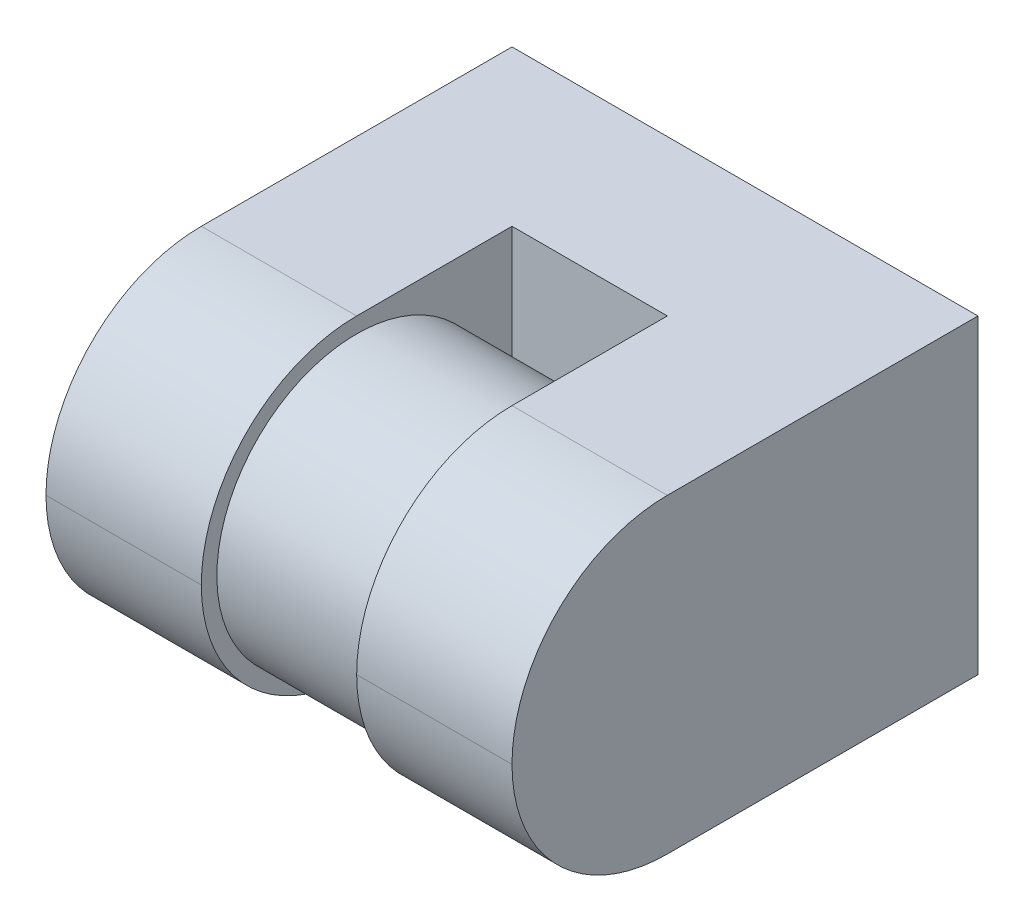
ISO-10303-21;
HEADER;
FILE_DESCRIPTION(('STEP AP214'),'2;1');
FILE_NAME('part.step','',(''),(''),'','','');
FILE_SCHEMA(('AUTOMOTIVE_DESIGN { 1 0 10303 214 1 1 1 1 }'));
ENDSEC;
DATA;
#1=APPLICATION_CONTEXT('core data for automotive mechanical design processes');
#2=APPLICATION_PROTOCOL_DEFINITION('international standard','automotive_design',2000,#1);
#3=PRODUCT_CONTEXT('',#1,'mechanical');
#4=PRODUCT('Part','Part','',(#3));
#5=PRODUCT_RELATED_PRODUCT_CATEGORY('part','',(#4));
#6=PRODUCT_DEFINITION_FORMATION('','',#4);
#7=PRODUCT_DEFINITION_CONTEXT('part definition',#1,'design');
#8=PRODUCT_DEFINITION('design','',#6,#7);
#9=PRODUCT_DEFINITION_SHAPE('','',#8);
#10=(LENGTH_UNIT() NAMED_UNIT(*) SI_UNIT(.MILLI.,.METRE.));
#11=(NAMED_UNIT(*) PLANE_ANGLE_UNIT() SI_UNIT($,.RADIAN.));
#12=(NAMED_UNIT(*) SI_UNIT($,.STERADIAN.) SOLID_ANGLE_UNIT());
#13=UNCERTAINTY_MEASURE_WITH_UNIT(LENGTH_MEASURE(1.E-05),#10,'distance_accuracy_value','');
#14=(GEOMETRIC_REPRESENTATION_CONTEXT(3) GLOBAL_UNCERTAINTY_ASSIGNED_CONTEXT((#13)) GLOBAL_UNIT_ASSIGNED_CONTEXT((#10,
#11,#12)) REPRESENTATION_CONTEXT('',''));
#15=CARTESIAN_POINT('',(0.,0.,0.));
#16=DIRECTION('',(0.,0.,1.));
#17=DIRECTION('',(1.,0.,0.));
#18=AXIS2_PLACEMENT_3D('',#15,#16,#17);
#19=CARTESIAN_POINT('',(0.,0.,10.));
#20=DIRECTION('',(0.,0.,-1.));
#21=DIRECTION('',(-1.,0.,0.));
#22=AXIS2_PLACEMENT_3D('',#19,#20,#21);
#23=PLANE('',#22);
#24=CARTESIAN_POINT('',(15.,10.,10.));
#25=DIRECTION('',(0.,0.,1.));
#26=DIRECTION('',(1.,0.,0.));
#27=AXIS2_PLACEMENT_3D('',#24,#25,#26);
#28=CIRCLE('',#27,2.6);
#29=CARTESIAN_POINT('',(17.6,10.,10.));
#30=VERTEX_POINT('',#29);
#31=EDGE_CURVE('E162',#30,#30,#28,.T.);
#32=ORIENTED_EDGE('',*,*,#31,.F.);
#33=EDGE_LOOP('',(#32));
#34=FACE_BOUND('',#33,.T.);
#35=DIRECTION('',(0.,-1.,0.));
#36=VECTOR('',#35,1.);
#37=CARTESIAN_POINT('',(20.,0.,10.));
#38=LINE('',#37,#36);
#39=CARTESIAN_POINT('',(20.,20.,10.));
#40=VERTEX_POINT('',#39);
#41=CARTESIAN_POINT('',(20.,0.,10.));
#42=VERTEX_POINT('',#41);
#43=EDGE_CURVE('E127',#40,#42,#38,.T.);
#44=ORIENTED_EDGE('',*,*,#43,.F.);
#45=DIRECTION('',(-1.,0.,0.));
#46=VECTOR('',#45,1.);
#47=CARTESIAN_POINT('',(0.,20.,10.));
#48=LINE('',#47,#46);
#49=CARTESIAN_POINT('',(10.,20.,10.));
#50=VERTEX_POINT('',#49);
#51=EDGE_CURVE('E136',#40,#50,#48,.T.);
#52=ORIENTED_EDGE('',*,*,#51,.T.);
#53=DIRECTION('',(0.,1.,0.));
#54=VECTOR('',#53,1.);
#55=CARTESIAN_POINT('',(10.,20.,10.));
#56=LINE('',#55,#54);
#57=CARTESIAN_POINT('',(10.,0.,10.));
#58=VERTEX_POINT('',#57);
#59=EDGE_CURVE('E150',#58,#50,#56,.T.);
#60=ORIENTED_EDGE('',*,*,#59,.F.);
#61=DIRECTION('',(1.,0.,0.));
#62=VECTOR('',#61,1.);
#63=CARTESIAN_POINT('',(0.,0.,10.));
#64=LINE('',#63,#62);
#65=EDGE_CURVE('E145',#58,#42,#64,.T.);
#66=ORIENTED_EDGE('',*,*,#65,.T.);
#67=EDGE_LOOP('',(#44,#52,#60,#66));
#68=FACE_BOUND('',#67,.T.);
#69=ADVANCED_FACE('F45',(#34,#68),#23,.F.);
#70=CARTESIAN_POINT('',(0.,0.,0.));
#71=DIRECTION('',(0.,0.,-1.));
#72=DIRECTION('',(-1.,0.,0.));
#73=AXIS2_PLACEMENT_3D('',#70,#71,#72);
#74=PLANE('',#73);
#75=DIRECTION('',(0.,-1.,0.));
#76=VECTOR('',#75,1.);
#77=CARTESIAN_POINT('',(0.,0.,0.));
#78=LINE('',#77,#76);
#79=CARTESIAN_POINT('',(0.,20.,0.));
#80=VERTEX_POINT('',#79);
#81=CARTESIAN_POINT('',(0.,0.,0.));
#82=VERTEX_POINT('',#81);
#83=EDGE_CURVE('E166',#80,#82,#78,.T.);
#84=ORIENTED_EDGE('',*,*,#83,.F.);
#85=DIRECTION('',(-1.,0.,0.));
#86=VECTOR('',#85,1.);
#87=CARTESIAN_POINT('',(0.,20.,0.));
#88=LINE('',#87,#86);
#89=CARTESIAN_POINT('',(30.,20.,0.));
#90=VERTEX_POINT('',#89);
#91=EDGE_CURVE('E171',#90,#80,#88,.T.);
#92=ORIENTED_EDGE('',*,*,#91,.F.);
#93=DIRECTION('',(0.,1.,0.));
#94=VECTOR('',#93,1.);
#95=CARTESIAN_POINT('',(30.,0.,0.));
#96=LINE('',#95,#94);
#97=CARTESIAN_POINT('',(30.,0.,0.));
#98=VERTEX_POINT('',#97);
#99=EDGE_CURVE('E180',#98,#90,#96,.T.);
#100=ORIENTED_EDGE('',*,*,#99,.F.);
#101=DIRECTION('',(1.,0.,0.));
#102=VECTOR('',#101,1.);
#103=CARTESIAN_POINT('',(0.,0.,0.));
#104=LINE('',#103,#102);
#105=EDGE_CURVE('E176',#82,#98,#104,.T.);
#106=ORIENTED_EDGE('',*,*,#105,.F.);
#107=EDGE_LOOP('',(#84,#92,#100,#106));
#108=FACE_BOUND('',#107,.T.);
#109=CARTESIAN_POINT('',(15.,10.,0.));
#110=DIRECTION('',(0.,0.,1.));
#111=DIRECTION('',(1.,0.,0.));
#112=AXIS2_PLACEMENT_3D('',#109,#110,#111);
#113=CIRCLE('',#112,2.6);
#114=CARTESIAN_POINT('',(17.6,10.,0.));
#115=VERTEX_POINT('',#114);
#116=EDGE_CURVE('E161',#115,#115,#113,.T.);
#117=ORIENTED_EDGE('',*,*,#116,.T.);
#118=EDGE_LOOP('',(#117));
#119=FACE_BOUND('',#118,.T.);
#120=ADVANCED_FACE('F271',(#108,#119),#74,.T.);
#121=CARTESIAN_POINT('',(0.,0.,10.));
#122=DIRECTION('',(1.,0.,0.));
#123=DIRECTION('',(0.,0.,-1.));
#124=AXIS2_PLACEMENT_3D('',#121,#122,#123);
#125=PLANE('',#124);
#126=DIRECTION('',(0.,0.,-1.));
#127=VECTOR('',#126,1.);
#128=CARTESIAN_POINT('',(0.,0.,10.));
#129=LINE('',#128,#127);
#130=CARTESIAN_POINT('',(0.,0.,20.));
#131=VERTEX_POINT('',#130);
#132=EDGE_CURVE('E195',#131,#82,#129,.T.);
#133=ORIENTED_EDGE('',*,*,#132,.F.);
#134=CARTESIAN_POINT('',(0.,10.,20.));
#135=DIRECTION('',(1.,0.,0.));
#136=DIRECTION('',(0.,0.,-1.));
#137=AXIS2_PLACEMENT_3D('',#134,#135,#136);
#138=CIRCLE('',#137,10.);
#139=CARTESIAN_POINT('',(0.,10.,30.));
#140=VERTEX_POINT('',#139);
#141=EDGE_CURVE('E68',#131,#140,#138,.F.);
#142=ORIENTED_EDGE('',*,*,#141,.T.);
#143=CARTESIAN_POINT('',(0.,10.,20.));
#144=DIRECTION('',(1.,0.,0.));
#145=DIRECTION('',(0.,0.,-1.));
#146=AXIS2_PLACEMENT_3D('',#143,#144,#145);
#147=CIRCLE('',#146,10.);
#148=CARTESIAN_POINT('',(0.,20.,20.));
#149=VERTEX_POINT('',#148);
#150=EDGE_CURVE('E63',#140,#149,#147,.F.);
#151=ORIENTED_EDGE('',*,*,#150,.T.);
#152=DIRECTION('',(0.,0.,-1.));
#153=VECTOR('',#152,1.);
#154=CARTESIAN_POINT('',(0.,20.,10.));
#155=LINE('',#154,#153);
#156=EDGE_CURVE('E144',#149,#80,#155,.T.);
#157=ORIENTED_EDGE('',*,*,#156,.T.);
#158=ORIENTED_EDGE('',*,*,#83,.T.);
#159=EDGE_LOOP('',(#133,#142,#151,#157,#158));
#160=FACE_BOUND('',#159,.T.);
#161=ADVANCED_FACE('F273',(#160),#125,.F.);
#162=CARTESIAN_POINT('',(0.,0.,10.));
#163=DIRECTION('',(0.,1.,0.));
#164=DIRECTION('',(0.,0.,1.));
#165=AXIS2_PLACEMENT_3D('',#162,#163,#164);
#166=PLANE('',#165);
#167=DIRECTION('',(0.,0.,-1.));
#168=VECTOR('',#167,1.);
#169=CARTESIAN_POINT('',(30.,0.,10.));
#170=LINE('',#169,#168);
#171=CARTESIAN_POINT('',(30.,0.,20.));
#172=VERTEX_POINT('',#171);
#173=EDGE_CURVE('E192',#172,#98,#170,.T.);
#174=ORIENTED_EDGE('',*,*,#173,.F.);
#175=DIRECTION('',(1.,0.,0.));
#176=VECTOR('',#175,1.);
#177=CARTESIAN_POINT('',(0.,0.,20.));
#178=LINE('',#177,#176);
#179=CARTESIAN_POINT('',(20.,0.,20.));
#180=VERTEX_POINT('',#179);
#181=EDGE_CURVE('E216',#172,#180,#178,.F.);
#182=ORIENTED_EDGE('',*,*,#181,.T.);
#183=DIRECTION('',(0.,0.,-1.));
#184=VECTOR('',#183,1.);
#185=CARTESIAN_POINT('',(20.,0.,30.));
#186=LINE('',#185,#184);
#187=EDGE_CURVE('E133',#180,#42,#186,.T.);
#188=ORIENTED_EDGE('',*,*,#187,.T.);
#189=ORIENTED_EDGE('',*,*,#65,.F.);
#190=DIRECTION('',(0.,0.,-1.));
#191=VECTOR('',#190,1.);
#192=CARTESIAN_POINT('',(10.,0.,30.));
#193=LINE('',#192,#191);
#194=CARTESIAN_POINT('',(10.,0.,20.));
#195=VERTEX_POINT('',#194);
#196=EDGE_CURVE('E158',#195,#58,#193,.T.);
#197=ORIENTED_EDGE('',*,*,#196,.F.);
#198=DIRECTION('',(1.,0.,0.));
#199=VECTOR('',#198,1.);
#200=CARTESIAN_POINT('',(0.,0.,20.));
#201=LINE('',#200,#199);
#202=EDGE_CURVE('E212',#195,#131,#201,.F.);
#203=ORIENTED_EDGE('',*,*,#202,.T.);
#204=ORIENTED_EDGE('',*,*,#132,.T.);
#205=ORIENTED_EDGE('',*,*,#105,.T.);
#206=EDGE_LOOP('',(#174,#182,#188,#189,#197,#203,#204,#205));
#207=FACE_BOUND('',#206,.T.);
#208=ADVANCED_FACE('F258',(#207),#166,.F.);
#209=CARTESIAN_POINT('',(30.,0.,10.));
#210=DIRECTION('',(-1.,0.,0.));
#211=DIRECTION('',(0.,0.,1.));
#212=AXIS2_PLACEMENT_3D('',#209,#210,#211);
#213=PLANE('',#212);
#214=CARTESIAN_POINT('',(30.,10.,20.));
#215=DIRECTION('',(-1.,0.,0.));
#216=DIRECTION('',(0.,0.,1.));
#217=AXIS2_PLACEMENT_3D('',#214,#215,#216);
#218=CIRCLE('',#217,10.);
#219=CARTESIAN_POINT('',(30.,20.,20.));
#220=VERTEX_POINT('',#219);
#221=CARTESIAN_POINT('',(30.,10.,30.));
#222=VERTEX_POINT('',#221);
#223=EDGE_CURVE('E206',#220,#222,#218,.F.);
#224=ORIENTED_EDGE('',*,*,#223,.T.);
#225=CARTESIAN_POINT('',(30.,10.,20.));
#226=DIRECTION('',(-1.,0.,0.));
#227=DIRECTION('',(0.,0.,1.));
#228=AXIS2_PLACEMENT_3D('',#225,#226,#227);
#229=CIRCLE('',#228,10.);
#230=EDGE_CURVE('E209',#222,#172,#229,.F.);
#231=ORIENTED_EDGE('',*,*,#230,.T.);
#232=ORIENTED_EDGE('',*,*,#173,.T.);
#233=ORIENTED_EDGE('',*,*,#99,.T.);
#234=DIRECTION('',(0.,0.,-1.));
#235=VECTOR('',#234,1.);
#236=CARTESIAN_POINT('',(30.,20.,10.));
#237=LINE('',#236,#235);
#238=EDGE_CURVE('E189',#220,#90,#237,.T.);
#239=ORIENTED_EDGE('',*,*,#238,.F.);
#240=EDGE_LOOP('',(#224,#231,#232,#233,#239));
#241=FACE_BOUND('',#240,.T.);
#242=ADVANCED_FACE('F265',(#241),#213,.F.);
#243=CARTESIAN_POINT('',(0.,20.,10.));
#244=DIRECTION('',(0.,-1.,0.));
#245=DIRECTION('',(0.,0.,-1.));
#246=AXIS2_PLACEMENT_3D('',#243,#244,#245);
#247=PLANE('',#246);
#248=DIRECTION('',(0.,0.,-1.));
#249=VECTOR('',#248,1.);
#250=CARTESIAN_POINT('',(20.,20.,30.));
#251=LINE('',#250,#249);
#252=CARTESIAN_POINT('',(20.,20.,20.));
#253=VERTEX_POINT('',#252);
#254=EDGE_CURVE('E122',#253,#40,#251,.T.);
#255=ORIENTED_EDGE('',*,*,#254,.F.);
#256=DIRECTION('',(-1.,0.,0.));
#257=VECTOR('',#256,1.);
#258=CARTESIAN_POINT('',(0.,20.,20.));
#259=LINE('',#258,#257);
#260=EDGE_CURVE('E11',#253,#220,#259,.F.);
#261=ORIENTED_EDGE('',*,*,#260,.T.);
#262=ORIENTED_EDGE('',*,*,#238,.T.);
#263=ORIENTED_EDGE('',*,*,#91,.T.);
#264=ORIENTED_EDGE('',*,*,#156,.F.);
#265=DIRECTION('',(-1.,0.,0.));
#266=VECTOR('',#265,1.);
#267=CARTESIAN_POINT('',(10.,20.,20.));
#268=LINE('',#267,#266);
#269=CARTESIAN_POINT('',(10.,20.,20.));
#270=VERTEX_POINT('',#269);
#271=EDGE_CURVE('E55',#149,#270,#268,.F.);
#272=ORIENTED_EDGE('',*,*,#271,.T.);
#273=DIRECTION('',(0.,0.,-1.));
#274=VECTOR('',#273,1.);
#275=CARTESIAN_POINT('',(10.,20.,30.));
#276=LINE('',#275,#274);
#277=EDGE_CURVE('E139',#270,#50,#276,.T.);
#278=ORIENTED_EDGE('',*,*,#277,.T.);
#279=ORIENTED_EDGE('',*,*,#51,.F.);
#280=EDGE_LOOP('',(#255,#261,#262,#263,#264,#272,#278,#279));
#281=FACE_BOUND('',#280,.T.);
#282=ADVANCED_FACE('F137',(#281),#247,.F.);
#283=CARTESIAN_POINT('',(15.,10.,10.));
#284=DIRECTION('',(0.,0.,-1.));
#285=DIRECTION('',(-1.,0.,0.));
#286=AXIS2_PLACEMENT_3D('',#283,#284,#285);
#287=CYLINDRICAL_SURFACE('',#286,2.6);
#288=ORIENTED_EDGE('',*,*,#31,.T.);
#289=EDGE_LOOP('',(#288));
#290=FACE_BOUND('',#289,.T.);
#291=ORIENTED_EDGE('',*,*,#116,.F.);
#292=EDGE_LOOP('',(#291));
#293=FACE_BOUND('',#292,.T.);
#294=ADVANCED_FACE('F295',(#290,#293),#287,.F.);
#295=CARTESIAN_POINT('',(10.,20.,30.));
#296=DIRECTION('',(-1.,0.,0.));
#297=DIRECTION('',(0.,-1.,0.));
#298=AXIS2_PLACEMENT_3D('',#295,#296,#297);
#299=PLANE('',#298);
#300=CARTESIAN_POINT('',(10.,10.,20.));
#301=DIRECTION('',(-1.,0.,0.));
#302=DIRECTION('',(0.,-1.,0.));
#303=AXIS2_PLACEMENT_3D('',#300,#301,#302);
#304=CIRCLE('',#303,9.);
#305=CARTESIAN_POINT('',(10.,1.,20.));
#306=VERTEX_POINT('',#305);
#307=EDGE_CURVE('E202',#306,#306,#304,.F.);
#308=ORIENTED_EDGE('',*,*,#307,.F.);
#309=EDGE_LOOP('',(#308));
#310=FACE_BOUND('',#309,.T.);
#311=CARTESIAN_POINT('',(10.,10.,20.));
#312=DIRECTION('',(-1.,0.,0.));
#313=DIRECTION('',(0.,-1.,0.));
#314=AXIS2_PLACEMENT_3D('',#311,#312,#313);
#315=CIRCLE('',#314,10.);
#316=CARTESIAN_POINT('',(10.,10.,30.));
#317=VERTEX_POINT('',#316);
#318=EDGE_CURVE('E225',#270,#317,#315,.F.);
#319=ORIENTED_EDGE('',*,*,#318,.T.);
#320=CARTESIAN_POINT('',(10.,10.,20.));
#321=DIRECTION('',(-1.,0.,0.));
#322=DIRECTION('',(0.,-1.,0.));
#323=AXIS2_PLACEMENT_3D('',#320,#321,#322);
#324=CIRCLE('',#323,10.);
#325=EDGE_CURVE('E228',#317,#195,#324,.F.);
#326=ORIENTED_EDGE('',*,*,#325,.T.);
#327=ORIENTED_EDGE('',*,*,#196,.T.);
#328=ORIENTED_EDGE('',*,*,#59,.T.);
#329=ORIENTED_EDGE('',*,*,#277,.F.);
#330=EDGE_LOOP('',(#319,#326,#327,#328,#329));
#331=FACE_BOUND('',#330,.T.);
#332=ADVANCED_FACE('F254',(#310,#331),#299,.F.);
#333=CARTESIAN_POINT('',(20.,0.,30.));
#334=DIRECTION('',(1.,0.,0.));
#335=DIRECTION('',(0.,0.,-1.));
#336=AXIS2_PLACEMENT_3D('',#333,#334,#335);
#337=PLANE('',#336);
#338=CARTESIAN_POINT('',(20.,10.,20.));
#339=DIRECTION('',(1.,0.,0.));
#340=DIRECTION('',(0.,0.,-1.));
#341=AXIS2_PLACEMENT_3D('',#338,#339,#340);
#342=CIRCLE('',#341,9.);
#343=CARTESIAN_POINT('',(20.,10.,11.));
#344=VERTEX_POINT('',#343);
#345=EDGE_CURVE('E198',#344,#344,#342,.F.);
#346=ORIENTED_EDGE('',*,*,#345,.F.);
#347=EDGE_LOOP('',(#346));
#348=FACE_BOUND('',#347,.T.);
#349=ORIENTED_EDGE('',*,*,#187,.F.);
#350=CARTESIAN_POINT('',(20.,10.,20.));
#351=DIRECTION('',(1.,0.,0.));
#352=DIRECTION('',(0.,0.,-1.));
#353=AXIS2_PLACEMENT_3D('',#350,#351,#352);
#354=CIRCLE('',#353,10.);
#355=CARTESIAN_POINT('',(20.,10.,30.));
#356=VERTEX_POINT('',#355);
#357=EDGE_CURVE('E222',#180,#356,#354,.F.);
#358=ORIENTED_EDGE('',*,*,#357,.T.);
#359=CARTESIAN_POINT('',(20.,10.,20.));
#360=DIRECTION('',(1.,0.,0.));
#361=DIRECTION('',(0.,0.,-1.));
#362=AXIS2_PLACEMENT_3D('',#359,#360,#361);
#363=CIRCLE('',#362,10.);
#364=EDGE_CURVE('E129',#356,#253,#363,.F.);
#365=ORIENTED_EDGE('',*,*,#364,.T.);
#366=ORIENTED_EDGE('',*,*,#254,.T.);
#367=ORIENTED_EDGE('',*,*,#43,.T.);
#368=EDGE_LOOP('',(#349,#358,#365,#366,#367));
#369=FACE_BOUND('',#368,.T.);
#370=ADVANCED_FACE('F125',(#348,#369),#337,.F.);
#371=CARTESIAN_POINT('',(20.,10.,20.));
#372=DIRECTION('',(-1.,0.,0.));
#373=DIRECTION('',(0.,-1.,0.));
#374=AXIS2_PLACEMENT_3D('',#371,#372,#373);
#375=CYLINDRICAL_SURFACE('',#374,9.);
#376=ORIENTED_EDGE('',*,*,#345,.T.);
#377=EDGE_LOOP('',(#376));
#378=FACE_BOUND('',#377,.T.);
#379=ORIENTED_EDGE('',*,*,#307,.T.);
#380=EDGE_LOOP('',(#379));
#381=FACE_BOUND('',#380,.T.);
#382=ADVANCED_FACE('F281',(#378,#381),#375,.T.);
#383=CARTESIAN_POINT('',(0.,10.,20.));
#384=DIRECTION('',(-1.,0.,0.));
#385=DIRECTION('',(0.,0.,1.));
#386=AXIS2_PLACEMENT_3D('',#383,#384,#385);
#387=CYLINDRICAL_SURFACE('',#386,10.);
#388=ORIENTED_EDGE('',*,*,#260,.F.);
#389=ORIENTED_EDGE('',*,*,#364,.F.);
#390=DIRECTION('',(-1.,0.,0.));
#391=VECTOR('',#390,1.);
#392=CARTESIAN_POINT('',(0.,10.,30.));
#393=LINE('',#392,#391);
#394=EDGE_CURVE('E236',#222,#356,#393,.T.);
#395=ORIENTED_EDGE('',*,*,#394,.F.);
#396=ORIENTED_EDGE('',*,*,#223,.F.);
#397=EDGE_LOOP('',(#388,#389,#395,#396));
#398=FACE_BOUND('',#397,.T.);
#399=ADVANCED_FACE('F261',(#398),#387,.T.);
#400=CARTESIAN_POINT('',(0.,10.,20.));
#401=DIRECTION('',(1.,0.,0.));
#402=DIRECTION('',(0.,0.,-1.));
#403=AXIS2_PLACEMENT_3D('',#400,#401,#402);
#404=CYLINDRICAL_SURFACE('',#403,10.);
#405=ORIENTED_EDGE('',*,*,#357,.F.);
#406=ORIENTED_EDGE('',*,*,#181,.F.);
#407=ORIENTED_EDGE('',*,*,#230,.F.);
#408=ORIENTED_EDGE('',*,*,#394,.T.);
#409=EDGE_LOOP('',(#405,#406,#407,#408));
#410=FACE_BOUND('',#409,.T.);
#411=ADVANCED_FACE('F274',(#410),#404,.T.);
#412=CARTESIAN_POINT('',(0.,10.,20.));
#413=DIRECTION('',(1.,0.,0.));
#414=DIRECTION('',(0.,0.,-1.));
#415=AXIS2_PLACEMENT_3D('',#412,#413,#414);
#416=CYLINDRICAL_SURFACE('',#415,10.);
#417=ORIENTED_EDGE('',*,*,#271,.F.);
#418=ORIENTED_EDGE('',*,*,#150,.F.);
#419=DIRECTION('',(-1.,0.,0.));
#420=VECTOR('',#419,1.);
#421=CARTESIAN_POINT('',(0.,10.,30.));
#422=LINE('',#421,#420);
#423=EDGE_CURVE('E49',#317,#140,#422,.T.);
#424=ORIENTED_EDGE('',*,*,#423,.F.);
#425=ORIENTED_EDGE('',*,*,#318,.F.);
#426=EDGE_LOOP('',(#417,#418,#424,#425));
#427=FACE_BOUND('',#426,.T.);
#428=ADVANCED_FACE('F47',(#427),#416,.T.);
#429=CARTESIAN_POINT('',(0.,10.,20.));
#430=DIRECTION('',(-1.,0.,0.));
#431=DIRECTION('',(0.,0.,1.));
#432=AXIS2_PLACEMENT_3D('',#429,#430,#431);
#433=CYLINDRICAL_SURFACE('',#432,10.);
#434=ORIENTED_EDGE('',*,*,#141,.F.);
#435=ORIENTED_EDGE('',*,*,#202,.F.);
#436=ORIENTED_EDGE('',*,*,#325,.F.);
#437=ORIENTED_EDGE('',*,*,#423,.T.);
#438=EDGE_LOOP('',(#434,#435,#436,#437));
#439=FACE_BOUND('',#438,.T.);
#440=ADVANCED_FACE('F248',(#439),#433,.T.);
#441=CLOSED_SHELL('',(#69,#120,#161,#208,#242,#282,#294,#332,#370,#382,#399,#411,#428,#440));
#442=MANIFOLD_SOLID_BREP('B2',#441);
#443=ADVANCED_BREP_SHAPE_REPRESENTATION('',(#18,#442),#14);
#444=SHAPE_DEFINITION_REPRESENTATION(#9,#443);
ENDSEC;
END-ISO-10303-21;
